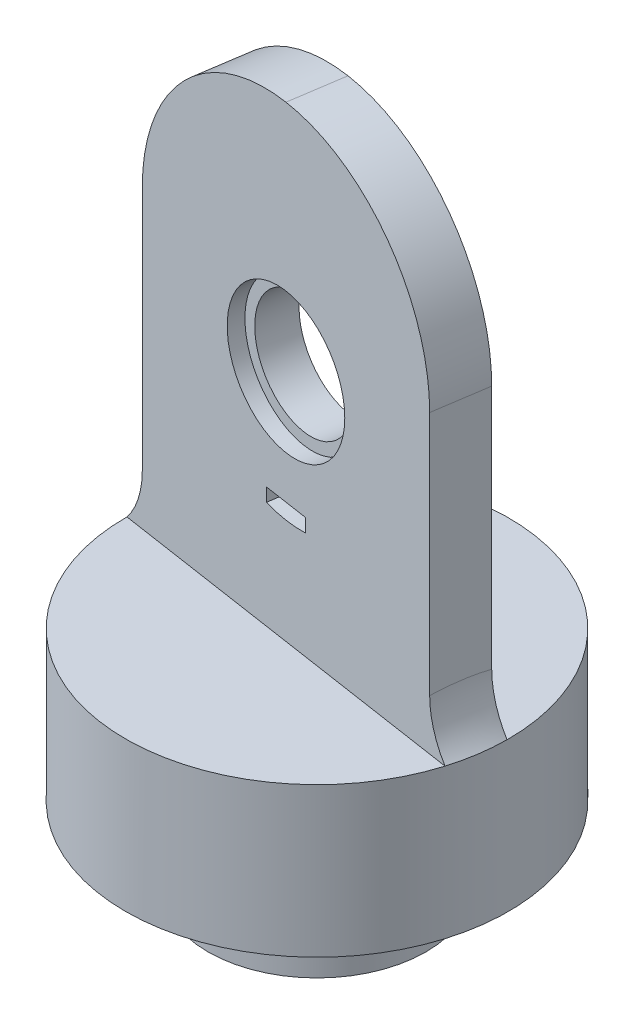
ISO-10303-21;
HEADER;
FILE_DESCRIPTION(('STEP AP214'),'2;1');
FILE_NAME('part.step','',(''),(''),'','','');
FILE_SCHEMA(('AUTOMOTIVE_DESIGN { 1 0 10303 214 1 1 1 1 }'));
ENDSEC;
DATA;
#1=APPLICATION_CONTEXT('core data for automotive mechanical design processes');
#2=APPLICATION_PROTOCOL_DEFINITION('international standard','automotive_design',2000,#1);
#3=PRODUCT_CONTEXT('',#1,'mechanical');
#4=PRODUCT('Part','Part','',(#3));
#5=PRODUCT_RELATED_PRODUCT_CATEGORY('part','',(#4));
#6=PRODUCT_DEFINITION_FORMATION('','',#4);
#7=PRODUCT_DEFINITION_CONTEXT('part definition',#1,'design');
#8=PRODUCT_DEFINITION('design','',#6,#7);
#9=PRODUCT_DEFINITION_SHAPE('','',#8);
#10=(LENGTH_UNIT() NAMED_UNIT(*) SI_UNIT(.MILLI.,.METRE.));
#11=(NAMED_UNIT(*) PLANE_ANGLE_UNIT() SI_UNIT($,.RADIAN.));
#12=(NAMED_UNIT(*) SI_UNIT($,.STERADIAN.) SOLID_ANGLE_UNIT());
#13=UNCERTAINTY_MEASURE_WITH_UNIT(LENGTH_MEASURE(1.E-05),#10,'distance_accuracy_value','');
#14=(GEOMETRIC_REPRESENTATION_CONTEXT(3) GLOBAL_UNCERTAINTY_ASSIGNED_CONTEXT((#13)) GLOBAL_UNIT_ASSIGNED_CONTEXT((#10,
#11,#12)) REPRESENTATION_CONTEXT('',''));
#15=CARTESIAN_POINT('',(0.,0.,0.));
#16=DIRECTION('',(0.,0.,1.));
#17=DIRECTION('',(1.,0.,0.));
#18=AXIS2_PLACEMENT_3D('',#15,#16,#17);
#19=CARTESIAN_POINT('',(0.,2.,0.));
#20=DIRECTION('',(0.,1.,0.));
#21=DIRECTION('',(0.,0.,1.));
#22=AXIS2_PLACEMENT_3D('',#19,#20,#21);
#23=PLANE('',#22);
#24=CARTESIAN_POINT('',(0.,2.,0.));
#25=DIRECTION('',(0.,1.,0.));
#26=DIRECTION('',(0.,0.,1.));
#27=AXIS2_PLACEMENT_3D('',#24,#25,#26);
#28=CIRCLE('',#27,12.3);
#29=CARTESIAN_POINT('',(-12.2996519217612,2.,-0.0925343369505793));
#30=VERTEX_POINT('',#29);
#31=CARTESIAN_POINT('',(11.7756354904741,2.,3.55308440590511));
#32=VERTEX_POINT('',#31);
#33=EDGE_CURVE('E209',#30,#32,#28,.T.);
#34=ORIENTED_EDGE('',*,*,#33,.T.);
#35=DIRECTION('',(0.988728591129862,0.,0.149718980367747));
#36=VECTOR('',#35,1.);
#37=CARTESIAN_POINT('',(-11.138022718072,2.,0.0833662504320445));
#38=LINE('',#37,#36);
#39=EDGE_CURVE('E177',#30,#32,#38,.T.);
#40=ORIENTED_EDGE('',*,*,#39,.F.);
#41=EDGE_LOOP('',(#34,#40));
#42=FACE_BOUND('',#41,.T.);
#43=ADVANCED_FACE('F33',(#42),#23,.T.);
#44=DIRECTION('',(0.988728591129862,0.,0.149718980367747));
#45=VECTOR('',#44,1.);
#46=CARTESIAN_POINT('',(-10.6140062867849,2.,-3.37718381852247));
#47=LINE('',#46,#45);
#48=CARTESIAN_POINT('',(-11.7756354904741,2.,-3.55308440590511));
#49=VERTEX_POINT('',#48);
#50=CARTESIAN_POINT('',(12.2996519217612,2.,0.0925343369505866));
#51=VERTEX_POINT('',#50);
#52=EDGE_CURVE('E179',#49,#51,#47,.T.);
#53=ORIENTED_EDGE('',*,*,#52,.T.);
#54=EDGE_CURVE('E212',#51,#49,#28,.T.);
#55=ORIENTED_EDGE('',*,*,#54,.T.);
#56=EDGE_LOOP('',(#53,#55));
#57=FACE_BOUND('',#56,.T.);
#58=ADVANCED_FACE('F354',(#57),#23,.T.);
#59=CARTESIAN_POINT('',(0.,2.,0.));
#60=DIRECTION('',(0.,-1.,0.));
#61=DIRECTION('',(0.,0.,-1.));
#62=AXIS2_PLACEMENT_3D('',#59,#60,#61);
#63=CYLINDRICAL_SURFACE('',#62,12.3);
#64=EDGE_CURVE('E206',#32,#51,#28,.T.);
#65=ORIENTED_EDGE('',*,*,#64,.F.);
#66=ORIENTED_EDGE('',*,*,#33,.F.);
#67=EDGE_CURVE('E350',#49,#30,#28,.T.);
#68=ORIENTED_EDGE('',*,*,#67,.F.);
#69=ORIENTED_EDGE('',*,*,#54,.F.);
#70=EDGE_LOOP('',(#65,#66,#68,#69));
#71=FACE_BOUND('',#70,.T.);
#72=CARTESIAN_POINT('',(0.,-7.6,0.));
#73=DIRECTION('',(0.,1.,0.));
#74=DIRECTION('',(0.,0.,1.));
#75=AXIS2_PLACEMENT_3D('',#72,#73,#74);
#76=CIRCLE('',#75,12.3);
#77=CARTESIAN_POINT('',(0.,-7.6,12.3));
#78=VERTEX_POINT('',#77);
#79=EDGE_CURVE('E201',#78,#78,#76,.T.);
#80=ORIENTED_EDGE('',*,*,#79,.T.);
#81=EDGE_LOOP('',(#80));
#82=FACE_BOUND('',#81,.T.);
#83=ADVANCED_FACE('F346',(#71,#82),#63,.T.);
#84=CARTESIAN_POINT('',(0.,-7.6,0.));
#85=DIRECTION('',(0.,1.,0.));
#86=DIRECTION('',(0.,0.,1.));
#87=AXIS2_PLACEMENT_3D('',#84,#85,#86);
#88=PLANE('',#87);
#89=CARTESIAN_POINT('',(0.,-7.6,0.));
#90=DIRECTION('',(0.,-1.,0.));
#91=DIRECTION('',(0.,0.,-1.));
#92=AXIS2_PLACEMENT_3D('',#89,#90,#91);
#93=CIRCLE('',#92,7.);
#94=CARTESIAN_POINT('',(0.,-7.6,-7.));
#95=VERTEX_POINT('',#94);
#96=EDGE_CURVE('E202',#95,#95,#93,.T.);
#97=ORIENTED_EDGE('',*,*,#96,.F.);
#98=EDGE_LOOP('',(#97));
#99=FACE_BOUND('',#98,.T.);
#100=ORIENTED_EDGE('',*,*,#79,.F.);
#101=EDGE_LOOP('',(#100));
#102=FACE_BOUND('',#101,.T.);
#103=ADVANCED_FACE('F360',(#99,#102),#88,.F.);
#104=CARTESIAN_POINT('',(0.,-12.5,0.));
#105=DIRECTION('',(0.,1.,0.));
#106=DIRECTION('',(0.,0.,1.));
#107=AXIS2_PLACEMENT_3D('',#104,#105,#106);
#108=CYLINDRICAL_SURFACE('',#107,7.);
#109=CARTESIAN_POINT('',(0.,-12.5,0.));
#110=DIRECTION('',(0.,-1.,0.));
#111=DIRECTION('',(0.,0.,-1.));
#112=AXIS2_PLACEMENT_3D('',#109,#110,#111);
#113=CIRCLE('',#112,7.);
#114=CARTESIAN_POINT('',(0.,-12.5,-7.));
#115=VERTEX_POINT('',#114);
#116=EDGE_CURVE('E196',#115,#115,#113,.T.);
#117=ORIENTED_EDGE('',*,*,#116,.F.);
#118=EDGE_LOOP('',(#117));
#119=FACE_BOUND('',#118,.T.);
#120=ORIENTED_EDGE('',*,*,#96,.T.);
#121=EDGE_LOOP('',(#120));
#122=FACE_BOUND('',#121,.T.);
#123=ADVANCED_FACE('F509',(#119,#122),#108,.T.);
#124=CARTESIAN_POINT('',(0.,-12.5,0.));
#125=DIRECTION('',(0.,-1.,0.));
#126=DIRECTION('',(0.,0.,-1.));
#127=AXIS2_PLACEMENT_3D('',#124,#125,#126);
#128=PLANE('',#127);
#129=CARTESIAN_POINT('',(0.,-12.5,0.));
#130=DIRECTION('',(0.,-1.,0.));
#131=DIRECTION('',(0.,0.,-1.));
#132=AXIS2_PLACEMENT_3D('',#129,#130,#131);
#133=CIRCLE('',#132,3.25);
#134=CARTESIAN_POINT('',(0.,-12.5,-3.25));
#135=VERTEX_POINT('',#134);
#136=EDGE_CURVE('E185',#135,#135,#133,.T.);
#137=ORIENTED_EDGE('',*,*,#136,.F.);
#138=EDGE_LOOP('',(#137));
#139=FACE_BOUND('',#138,.T.);
#140=ORIENTED_EDGE('',*,*,#116,.T.);
#141=EDGE_LOOP('',(#140));
#142=FACE_BOUND('',#141,.T.);
#143=ADVANCED_FACE('F500',(#139,#142),#128,.T.);
#144=CARTESIAN_POINT('',(0.,0.199999999999999,0.));
#145=DIRECTION('',(0.,-1.,0.));
#146=DIRECTION('',(0.,0.,-1.));
#147=AXIS2_PLACEMENT_3D('',#144,#145,#146);
#148=CYLINDRICAL_SURFACE('',#147,3.25);
#149=CARTESIAN_POINT('',(0.,0.199999999999999,0.));
#150=DIRECTION('',(0.,-1.,0.));
#151=DIRECTION('',(0.,0.,-1.));
#152=AXIS2_PLACEMENT_3D('',#149,#150,#151);
#153=CIRCLE('',#152,3.25);
#154=CARTESIAN_POINT('',(0.,0.199999999999999,-3.25));
#155=VERTEX_POINT('',#154);
#156=EDGE_CURVE('E193',#155,#155,#153,.T.);
#157=ORIENTED_EDGE('',*,*,#156,.F.);
#158=EDGE_LOOP('',(#157));
#159=FACE_BOUND('',#158,.T.);
#160=ORIENTED_EDGE('',*,*,#136,.T.);
#161=EDGE_LOOP('',(#160));
#162=FACE_BOUND('',#161,.T.);
#163=ADVANCED_FACE('F490',(#159,#162),#148,.F.);
#164=CARTESIAN_POINT('',(0.,0.199999999999999,0.));
#165=DIRECTION('',(0.,-1.,0.));
#166=DIRECTION('',(0.,0.,-1.));
#167=AXIS2_PLACEMENT_3D('',#164,#165,#166);
#168=PLANE('',#167);
#169=ORIENTED_EDGE('',*,*,#156,.T.);
#170=EDGE_LOOP('',(#169));
#171=FACE_BOUND('',#170,.T.);
#172=ADVANCED_FACE('F252',(#171),#168,.T.);
#173=CARTESIAN_POINT('',(11.138022718072,32.,-0.0833662504320454));
#174=DIRECTION('',(0.988728591129862,0.,0.149718980367746));
#175=DIRECTION('',(0.149718980367746,0.,-0.988728591129862));
#176=AXIS2_PLACEMENT_3D('',#173,#174,#175);
#177=PLANE('',#176);
#178=DIRECTION('',(0.,-1.,0.));
#179=VECTOR('',#178,1.);
#180=CARTESIAN_POINT('',(10.6140062867849,32.,3.37718381852247));
#181=LINE('',#180,#179);
#182=CARTESIAN_POINT('',(10.6140062867849,21.,3.37718381852247));
#183=VERTEX_POINT('',#182);
#184=CARTESIAN_POINT('',(10.6140062867849,5.25496507344838,3.37718381852247));
#185=VERTEX_POINT('',#184);
#186=EDGE_CURVE('E181',#183,#185,#181,.T.);
#187=ORIENTED_EDGE('',*,*,#186,.T.);
#188=CARTESIAN_POINT('',(10.3214639237666,4.82839180538561,5.30910318988391));
#189=CARTESIAN_POINT('',(10.3986652961498,3.26000817502607,4.79927334758672));
#190=CARTESIAN_POINT('',(11.4327059966444,2.,4.53687487090954));
#191=CARTESIAN_POINT('',(10.342585978601,4.87474183830589,5.16961533425665));
#192=CARTESIAN_POINT('',(10.4166230443052,3.27663489239898,4.68068224450884));
#193=CARTESIAN_POINT('',(11.4706790496654,2.,4.44120582104052));
#194=CARTESIAN_POINT('',(10.3638853220652,4.91735506347584,5.0289566829377));
#195=CARTESIAN_POINT('',(10.4347443174218,3.29151083388634,4.56101123957622));
#196=CARTESIAN_POINT('',(11.5079818106291,2.,4.34368149071787));
#197=CARTESIAN_POINT('',(10.4067548872042,4.99573483675469,4.74585052874036));
#198=CARTESIAN_POINT('',(10.4712952127414,3.3182835360083,4.31963292438134));
#199=CARTESIAN_POINT('',(11.5808797029572,2.,4.14539820359588));
#200=CARTESIAN_POINT('',(10.4283249791628,5.03150453950229,4.60340388249463));
#201=CARTESIAN_POINT('',(10.489721191021,3.33017150777237,4.19794967821051));
#202=CARTESIAN_POINT('',(11.6164756154242,2.,4.04464076228806));
#203=CARTESIAN_POINT('',(10.4716265754946,5.09679735594471,4.31744463918663));
#204=CARTESIAN_POINT('',(10.5267838928038,3.35142579754127,3.95319144630688));
#205=CARTESIAN_POINT('',(11.6855560399188,2.,3.84049213034124));
#206=CARTESIAN_POINT('',(10.4933576468343,5.12633340416124,4.17393490183294));
#207=CARTESIAN_POINT('',(10.5454157501711,3.36078926044809,3.83014859603067));
#208=CARTESIAN_POINT('',(11.7190448206797,2.,3.73710690209606));
#209=CARTESIAN_POINT('',(10.5369767109361,5.17974148796943,3.8858791343551));
#210=CARTESIAN_POINT('',(10.5828806339486,3.37739394932021,3.58273439601947));
#211=CARTESIAN_POINT('',(11.7837210611285,2.,3.52787733102598));
#212=CARTESIAN_POINT('',(10.5588647243665,5.20361276289023,3.74133296774002));
#213=CARTESIAN_POINT('',(10.6017085260136,3.38462851301482,3.45839695296721));
#214=CARTESIAN_POINT('',(11.8149082113644,2.,3.42203266003764));
#215=CARTESIAN_POINT('',(10.623878009283,5.26655215262242,3.31199198877905));
#216=CARTESIAN_POINT('',(10.6577603759894,3.40340551682259,3.08823635929532));
#217=CARTESIAN_POINT('',(11.9035299310385,2.,3.10537281065239));
#218=CARTESIAN_POINT('',(10.6671688992274,5.29813559755995,3.02610344934059));
#219=CARTESIAN_POINT('',(10.6951351202005,3.41233901238911,2.84141743161585));
#220=CARTESIAN_POINT('',(11.9573388235148,2.,2.89156946591438));
#221=CARTESIAN_POINT('',(10.7539918544662,5.3431111993212,2.45273367351071));
#222=CARTESIAN_POINT('',(10.7702635292307,3.42488954199525,2.34527722392919));
#223=CARTESIAN_POINT('',(12.0538391584883,2.,2.45850829389656));
#224=CARTESIAN_POINT('',(10.7975241039297,5.35648671418348,2.16525122088483));
#225=CARTESIAN_POINT('',(10.8079671635041,3.42848385167703,2.09628634044853));
#226=CARTESIAN_POINT('',(12.0965204016051,2.,2.23924566295477));
#227=CARTESIAN_POINT('',(10.8894469604464,5.36635290590999,1.55820222687525));
#228=CARTESIAN_POINT('',(10.8876675434005,3.43115626414959,1.56995331217154));
#229=CARTESIAN_POINT('',(12.1739641077632,2.,1.77375627106607));
#230=CARTESIAN_POINT('',(10.9378426242937,5.36081344007558,1.23860229094816));
#231=CARTESIAN_POINT('',(10.9296072216232,3.42968674554214,1.29298803455823));
#232=CARTESIAN_POINT('',(12.2073294788628,2.,1.52722836299262));
#233=CARTESIAN_POINT('',(11.0344366676583,5.32788386130741,0.600705264313045));
#234=CARTESIAN_POINT('',(11.0132868006651,3.42066275610049,0.740376788547306));
#235=CARTESIAN_POINT('',(12.2588716274398,2.,1.03499791901754));
#236=CARTESIAN_POINT('',(11.0826351763133,5.30051165217863,0.282407320792765));
#237=CARTESIAN_POINT('',(11.0549557441636,3.41312887559618,0.465199414924089));
#238=CARTESIAN_POINT('',(12.277060825048,2.,0.789294872412392));
#239=CARTESIAN_POINT('',(11.1551057758791,5.2410431253027,-0.196180989326531));
#240=CARTESIAN_POINT('',(11.1175362689066,3.39579652252535,0.0519241313940927));
#241=CARTESIAN_POINT('',(12.2934006217747,2.,0.42170235925767));
#242=CARTESIAN_POINT('',(11.1795448645373,5.21781267095227,-0.3575741916993));
#243=CARTESIAN_POINT('',(11.1385921749009,3.38892429400321,-0.0871268841651647));
#244=CARTESIAN_POINT('',(12.2970014244925,2.,0.29805967733537));
#245=CARTESIAN_POINT('',(11.2282555452492,5.1645959891964,-0.679254466270841));
#246=CARTESIAN_POINT('',(11.1804967727632,3.37273731431042,-0.363860494723964));
#247=CARTESIAN_POINT('',(12.3004995922828,2.,0.05257365543771));
#248=CARTESIAN_POINT('',(11.2525271634631,5.13461084273096,-0.839541711228594));
#249=CARTESIAN_POINT('',(11.2013379347778,3.36343062891468,-0.501493363352807));
#250=CARTESIAN_POINT('',(12.3003975494966,2.,-0.069269969116612));
#251=CARTESIAN_POINT('',(11.3008920235469,5.06721120553812,-1.1589382223019));
#252=CARTESIAN_POINT('',(11.2427927921006,3.34188750300052,-0.775256934114432));
#253=CARTESIAN_POINT('',(12.2966659835431,2.,-0.310816255603539));
#254=CARTESIAN_POINT('',(11.3249848053702,5.02978181168544,-1.31804445031652));
#255=CARTESIAN_POINT('',(11.2633994788085,3.32965539469422,-0.911341352178931));
#256=CARTESIAN_POINT('',(12.2930293264975,2.,-0.430514089062021));
#257=CARTESIAN_POINT('',(11.3728621781473,4.94667330965841,-1.63422164586434));
#258=CARTESIAN_POINT('',(11.3042649823875,3.30164135021393,-1.18121289204773));
#259=CARTESIAN_POINT('',(12.2824806776444,2.,-0.666895645381488));
#260=CARTESIAN_POINT('',(11.3966465917794,4.9009896624974,-1.79129144238287));
#261=CARTESIAN_POINT('',(11.3245184137625,3.28587071697418,-1.31496444859588));
#262=CARTESIAN_POINT('',(12.2755668803354,2.,-0.783577669303654));
#263=CARTESIAN_POINT('',(11.4202234374693,4.85076951524133,-1.94699048177643));
#264=CARTESIAN_POINT('',(11.344579861763,3.26799770168961,-1.44744816688476));
#265=CARTESIAN_POINT('',(12.2671480602123,2.,-0.898375460946205));
#266=(BOUNDED_SURFACE() B_SPLINE_SURFACE(3,2,((#188,#189,#190),(#191,#192,#193),(#194,#195,
#196),(#197,#198,#199),(#200,#201,#202),(#203,#204,#205),(#206,#207,#208),(#209,#210,#211),
(#212,#213,#214),(#215,#216,#217),(#218,#219,#220),(#221,#222,#223),(#224,#225,#226),(#227,#228,
#229),(#230,#231,#232),(#233,#234,#235),(#236,#237,#238),(#239,#240,#241),(#242,#243,#244),
(#245,#246,#247),(#248,#249,#250),(#251,#252,#253),(#254,#255,#256),(#257,#258,#259),(#260,#261,
#262),(#263,#264,#265)),.UNSPECIFIED.,.F.,.F.,.F.) B_SPLINE_SURFACE_WITH_KNOTS((4,2,2,2,2,2,2,2,
2,2,2,2,4),(3,3),(0.,0.445378405467933,0.890551008856788,1.33479061699057,1.77908984430686,
2.65098561402121,3.52367775846463,4.4928485547848,5.46122540473011,5.9557430850826,
6.45018168489714,6.94562028210751,7.44133215314482),(0.,1.),
.UNSPECIFIED.) GEOMETRIC_REPRESENTATION_ITEM() RATIONAL_B_SPLINE_SURFACE(((1.,0.949573611017432,
1.),(1.,0.948350895766873,1.),(1.,0.94717529807741,1.),(1.,0.944934959078809,1.),(1.,
0.943870166795765,1.),(1.,0.94186899937263,1.),(1.,0.94093235977216,1.),(1.,0.939197283093598,
1.),(1.,0.938398864579846,1.),(1.,0.936254605183784,1.),(1.,0.935121437832492,1.),(1.,
0.933485189333774,1.),(1.,0.932982684641708,1.),(1.,0.932614030476096,1.),(1.,0.932824373505298,
1.),(1.,0.934042174675482,1.),(1.,0.935048979677241,1.),(1.,0.937124918378328,1.),(1.,
0.937922475913505,1.),(1.,0.939695749850841,1.),(1.,0.940671437742422,1.),(1.,0.942787409640719,
1.),(1.,0.943928022550502,1.),(1.,0.946352045505888,1.),(1.,0.94763553396846,1.),(1.,
0.948979654115154,1.))) REPRESENTATION_ITEM('') SURFACE());
#267=CARTESIAN_POINT('',(10.3214639237666,4.82839180538561,5.30910318988391));
#268=CARTESIAN_POINT('',(10.342585978601,4.87474183830589,5.16961533425665));
#269=CARTESIAN_POINT('',(10.3638853220652,4.91735506347584,5.0289566829377));
#270=CARTESIAN_POINT('',(10.4067548872043,4.99573483675469,4.74585052874036));
#271=CARTESIAN_POINT('',(10.4283249791628,5.03150453950229,4.60340388249463));
#272=CARTESIAN_POINT('',(10.4716265754946,5.09679735594471,4.31744463918663));
#273=CARTESIAN_POINT('',(10.4933576468343,5.12633340416124,4.17393490183294));
#274=CARTESIAN_POINT('',(10.5369767109361,5.17974148796943,3.8858791343551));
#275=CARTESIAN_POINT('',(10.5588647243665,5.20361276289023,3.74133296774002));
#276=CARTESIAN_POINT('',(10.623878009283,5.26655215262242,3.31199198877905));
#277=CARTESIAN_POINT('',(10.6671688992274,5.29813559755995,3.02610344934059));
#278=CARTESIAN_POINT('',(10.7539918544662,5.3431111993212,2.45273367351071));
#279=CARTESIAN_POINT('',(10.7975241039297,5.35648671418348,2.16525122088483));
#280=CARTESIAN_POINT('',(10.8894469604464,5.36635290590999,1.55820222687525));
#281=CARTESIAN_POINT('',(10.9378426242937,5.36081344007558,1.23860229094816));
#282=CARTESIAN_POINT('',(11.0344366676583,5.32788386130741,0.600705264313045));
#283=CARTESIAN_POINT('',(11.0826351763133,5.30051165217863,0.282407320792765));
#284=CARTESIAN_POINT('',(11.1551057758791,5.2410431253027,-0.196180989326531));
#285=CARTESIAN_POINT('',(11.1795448645373,5.21781267095227,-0.3575741916993));
#286=CARTESIAN_POINT('',(11.2282555452492,5.1645959891964,-0.679254466270841));
#287=CARTESIAN_POINT('',(11.2525271634631,5.13461084273096,-0.839541711228594));
#288=CARTESIAN_POINT('',(11.3008920235469,5.06721120553812,-1.1589382223019));
#289=CARTESIAN_POINT('',(11.3249848053702,5.02978181168544,-1.31804445031652));
#290=CARTESIAN_POINT('',(11.3728621781473,4.94667330965841,-1.63422164586434));
#291=CARTESIAN_POINT('',(11.3966465917794,4.9009896624974,-1.79129144238287));
#292=CARTESIAN_POINT('',(11.4202234374693,4.85076951524133,-1.94699048177643));
#293=B_SPLINE_CURVE_WITH_KNOTS('',3,(#267,#268,#269,#270,#271,#272,#273,#274,#275,#276,#277,
#278,#279,#280,#281,#282,#283,#284,#285,#286,#287,#288,#289,#290,#291,#292),.UNSPECIFIED.,.F.,
.F.,(4,2,2,2,2,2,2,2,2,2,2,2,4),(0.,0.445378405467933,0.890551008856788,1.33479061699057,
1.77908984430686,2.65098561402121,3.52367775846463,4.4928485547848,5.46122540473011,
5.9557430850826,6.45018168489714,6.94562028210751,7.44133215314482),.UNSPECIFIED.);
#294=CARTESIAN_POINT('',(11.138022718072,5.25496507344838,-0.0833662504320454));
#295=VERTEX_POINT('',#294);
#296=EDGE_CURVE('E225',#185,#295,#293,.T.);
#297=ORIENTED_EDGE('',*,*,#296,.T.);
#298=DIRECTION('',(0.,-1.,0.));
#299=VECTOR('',#298,1.);
#300=CARTESIAN_POINT('',(11.138022718072,32.,-0.0833662504320454));
#301=LINE('',#300,#299);
#302=CARTESIAN_POINT('',(11.138022718072,21.,-0.0833662504320454));
#303=VERTEX_POINT('',#302);
#304=EDGE_CURVE('E182',#303,#295,#301,.T.);
#305=ORIENTED_EDGE('',*,*,#304,.F.);
#306=DIRECTION('',(-0.149718980367746,0.,0.988728591129862));
#307=VECTOR('',#306,1.);
#308=CARTESIAN_POINT('',(11.138022718072,21.,-0.0833662504320454));
#309=LINE('',#308,#307);
#310=EDGE_CURVE('E223',#303,#183,#309,.T.);
#311=ORIENTED_EDGE('',*,*,#310,.T.);
#312=EDGE_LOOP('',(#187,#297,#305,#311));
#313=FACE_BOUND('',#312,.T.);
#314=ADVANCED_FACE('F246',(#313),#177,.T.);
#315=CARTESIAN_POINT('',(-10.6140062867849,32.,-3.37718381852247));
#316=DIRECTION('',(0.149718980367747,0.,-0.988728591129862));
#317=DIRECTION('',(-0.988728591129862,0.,-0.149718980367747));
#318=AXIS2_PLACEMENT_3D('',#315,#316,#317);
#319=PLANE('',#318);
#320=CARTESIAN_POINT('',(0.262008215643557,17.,-1.73027503447726));
#321=DIRECTION('',(0.149718980367747,0.,-0.988728591129862));
#322=DIRECTION('',(-0.988728591129862,0.,-0.149718980367747));
#323=AXIS2_PLACEMENT_3D('',#320,#321,#322);
#324=CIRCLE('',#323,3.75);
#325=CARTESIAN_POINT('',(-3.44572400109343,17.,-2.29172121085631));
#326=VERTEX_POINT('',#325);
#327=EDGE_CURVE('E161',#326,#326,#324,.F.);
#328=ORIENTED_EDGE('',*,*,#327,.T.);
#329=EDGE_LOOP('',(#328));
#330=FACE_BOUND('',#329,.T.);
#331=DIRECTION('',(0.,-1.,0.));
#332=VECTOR('',#331,1.);
#333=CARTESIAN_POINT('',(-10.6140062867849,32.,-3.37718381852247));
#334=LINE('',#333,#332);
#335=CARTESIAN_POINT('',(-10.6140062867849,21.,-3.37718381852247));
#336=VERTEX_POINT('',#335);
#337=CARTESIAN_POINT('',(-10.6140062867849,5.25496507344838,-3.37718381852247));
#338=VERTEX_POINT('',#337);
#339=EDGE_CURVE('E186',#336,#338,#334,.T.);
#340=ORIENTED_EDGE('',*,*,#339,.F.);
#341=CARTESIAN_POINT('',(0.262008215643555,21.,-1.73027503447726));
#342=DIRECTION('',(0.149718980367747,0.,-0.988728591129862));
#343=DIRECTION('',(-0.988728591129862,0.,-0.149718980367747));
#344=AXIS2_PLACEMENT_3D('',#341,#342,#343);
#345=CIRCLE('',#344,11.);
#346=CARTESIAN_POINT('',(0.26200821564356,32.,-1.73027503447726));
#347=VERTEX_POINT('',#346);
#348=EDGE_CURVE('E221',#336,#347,#345,.T.);
#349=ORIENTED_EDGE('',*,*,#348,.T.);
#350=CARTESIAN_POINT('',(0.262008215643558,21.,-1.73027503447726));
#351=DIRECTION('',(0.149718980367747,0.,-0.988728591129862));
#352=DIRECTION('',(-0.988728591129862,0.,-0.149718980367747));
#353=AXIS2_PLACEMENT_3D('',#350,#351,#352);
#354=CIRCLE('',#353,11.);
#355=EDGE_CURVE('E219',#347,#303,#354,.T.);
#356=ORIENTED_EDGE('',*,*,#355,.T.);
#357=ORIENTED_EDGE('',*,*,#304,.T.);
#358=CARTESIAN_POINT('',(11.138022718072,5.25496507344838,-0.0833662504320451));
#359=CARTESIAN_POINT('',(11.1380066805487,5.1095567470639,-0.0833686789262437));
#360=CARTESIAN_POINT('',(11.1441942813575,4.96415087450629,-0.0824317167585356));
#361=CARTESIAN_POINT('',(11.1688403134422,4.67442715262069,-0.0786996725687161));
#362=CARTESIAN_POINT('',(11.1872969899803,4.53010915068879,-0.075904856259113));
#363=CARTESIAN_POINT('',(11.2356515476384,4.24765164690677,-0.0685827305173828));
#364=CARTESIAN_POINT('',(11.2652112550172,4.10945281367856,-0.0641066293017031));
#365=CARTESIAN_POINT('',(11.3355670783171,3.83601251185544,-0.0534529451442));
#366=CARTESIAN_POINT('',(11.3763633065394,3.70077107283224,-0.0472753451970627));
#367=CARTESIAN_POINT('',(11.4713013812735,3.42727240615612,-0.0328992748833551));
#368=CARTESIAN_POINT('',(11.5260245159435,3.28922118485578,-0.0246127825144458));
#369=CARTESIAN_POINT('',(11.6471644471581,3.01846023255317,-0.00626907611616808));
#370=CARTESIAN_POINT('',(11.7135822326978,2.88575095447635,0.00378828767254911));
#371=CARTESIAN_POINT('',(11.859817645697,2.62272937005919,0.0259320965239405));
#372=CARTESIAN_POINT('',(11.9399831708467,2.49261473498774,0.0380712222594894));
#373=CARTESIAN_POINT('',(12.1115531735707,2.24018858254681,0.0640513406660813));
#374=CARTESIAN_POINT('',(12.2029583680589,2.11787756368163,0.0778924418963463));
#375=CARTESIAN_POINT('',(12.2996519217613,2.00000000000002,0.0925343369505956));
#376=B_SPLINE_CURVE_WITH_KNOTS('',3,(#358,#359,#360,#361,#362,#363,#364,#365,#366,#367,#368,
#369,#370,#371,#372,#373,#374,#375),.UNSPECIFIED.,.F.,.F.,(4,2,2,2,2,2,2,2,4),(0.,
0.436087812668885,0.872113268955345,1.29581296862591,1.71951690303828,2.16514320921757,
2.61080721931242,3.07011110165096,3.5294442955522),.UNSPECIFIED.);
#377=EDGE_CURVE('E304',#295,#51,#376,.T.);
#378=ORIENTED_EDGE('',*,*,#377,.T.);
#379=ORIENTED_EDGE('',*,*,#52,.F.);
#380=CARTESIAN_POINT('',(-10.3214639237666,4.8283918053856,-5.30910318988389));
#381=CARTESIAN_POINT('',(-10.3986652899304,3.26000817797223,-4.79927338865941));
#382=CARTESIAN_POINT('',(-11.4327059689429,2.,-4.53687494071618));
#383=CARTESIAN_POINT('',(-10.342585978601,4.87474183830588,-5.16961533425663));
#384=CARTESIAN_POINT('',(-10.4166230420621,3.27663489345301,-4.68068225932195));
#385=CARTESIAN_POINT('',(-11.4706790397148,2.,-4.44120584611646));
#386=CARTESIAN_POINT('',(-10.3638853220652,4.91735506347584,-5.02895668293769));
#387=CARTESIAN_POINT('',(-10.4347443168178,3.29151083416803,-4.56101124356519));
#388=CARTESIAN_POINT('',(-11.5079818079604,2.,-4.34368149744388));
#389=CARTESIAN_POINT('',(-10.4067548872043,4.99573483675469,-4.74585052874034));
#390=CARTESIAN_POINT('',(-10.4712952133485,3.31828353572911,-4.31963292037203));
#391=CARTESIAN_POINT('',(-11.5808797056189,2.,-4.14539819688862));
#392=CARTESIAN_POINT('',(-10.4283249791628,5.03150453950228,-4.60340388249462));
#393=CARTESIAN_POINT('',(-10.4897211911846,3.33017150769762,-4.19794967712961));
#394=CARTESIAN_POINT('',(-11.6164756161389,2.,-4.04464076048672));
#395=CARTESIAN_POINT('',(-10.4716265754946,5.0967973559447,-4.31744463918662));
#396=CARTESIAN_POINT('',(-10.5267838926398,3.3514257976153,-3.95319144739022));
#397=CARTESIAN_POINT('',(-11.6855560392077,2.,-3.84049213213278));
#398=CARTESIAN_POINT('',(-10.4933576468343,5.12633340416123,-4.17393490183293));
#399=CARTESIAN_POINT('',(-10.5454157501259,3.36078926046835,-3.83014859632898));
#400=CARTESIAN_POINT('',(-11.7190448204847,2.,-3.73710690258758));
#401=CARTESIAN_POINT('',(-10.5369767109361,5.17974148796943,-3.88587913435509));
#402=CARTESIAN_POINT('',(-10.582880633994,3.37739394930008,-3.58273439572007));
#403=CARTESIAN_POINT('',(-11.7837210613229,2.,-3.52787733053637));
#404=CARTESIAN_POINT('',(-10.5588647243665,5.20361276289022,-3.74133296774001));
#405=CARTESIAN_POINT('',(-10.6017085260294,3.38462851300784,-3.45839695286259));
#406=CARTESIAN_POINT('',(-11.814908211432,2.,-3.42203265986713));
#407=CARTESIAN_POINT('',(-10.623878009283,5.26655215262241,-3.31199198877905));
#408=CARTESIAN_POINT('',(-10.6577603759581,3.4034055168362,-3.08823635950196));
#409=CARTESIAN_POINT('',(-11.9035299309063,2.,-3.10537281098558));
#410=CARTESIAN_POINT('',(-10.6671688992274,5.29813559755994,-3.02610344934059));
#411=CARTESIAN_POINT('',(-10.6951351201917,3.4123390123928,-2.84141743167362));
#412=CARTESIAN_POINT('',(-11.9573388234786,2.,-2.89156946600715));
#413=CARTESIAN_POINT('',(-10.7539918544662,5.3431111993212,-2.45273367351071));
#414=CARTESIAN_POINT('',(-10.7702635292392,3.42488954199163,-2.34527722387291));
#415=CARTESIAN_POINT('',(-12.0538391585236,2.,-2.45850829380759));
#416=CARTESIAN_POINT('',(-10.7975241039297,5.35648671418347,-2.16525122088482));
#417=CARTESIAN_POINT('',(-10.8079671635069,3.42848385167601,-2.09628634042973));
#418=CARTESIAN_POINT('',(-12.0965204016159,2.,-2.23924566292475));
#419=CARTESIAN_POINT('',(-10.8894469604464,5.36635290590998,-1.55820222687524));
#420=CARTESIAN_POINT('',(-10.8876675433983,3.43115626415069,-1.56995331218611));
#421=CARTESIAN_POINT('',(-12.1739641077532,2.,-1.7737562710881));
#422=CARTESIAN_POINT('',(-10.9378426242937,5.36081344007557,-1.23860229094815));
#423=CARTESIAN_POINT('',(-10.9296072216225,3.42968674554242,-1.29298803456286));
#424=CARTESIAN_POINT('',(-12.20732947886,2.,-1.52722836299977));
#425=CARTESIAN_POINT('',(-11.0344366676583,5.3278838613074,-0.60070526431304));
#426=CARTESIAN_POINT('',(-11.0132868006656,3.42066275610018,-0.740376788544245));
#427=CARTESIAN_POINT('',(-12.2588716274423,2.,-1.03499791901323));
#428=CARTESIAN_POINT('',(-11.0826351763133,5.30051165217863,-0.282407320792762));
#429=CARTESIAN_POINT('',(-11.0549557441637,3.41312887559612,-0.465199414923458));
#430=CARTESIAN_POINT('',(-12.2770608250484,2.,-0.789294872411486));
#431=CARTESIAN_POINT('',(-11.1551057758791,5.2410431253027,0.196180989326533));
#432=CARTESIAN_POINT('',(-11.1175362689065,3.39579652252537,-0.0519241313946269));
#433=CARTESIAN_POINT('',(-12.2934006217744,2.,-0.421702359258504));
#434=CARTESIAN_POINT('',(-11.1795448645373,5.21781267095227,0.357574191699303));
#435=CARTESIAN_POINT('',(-11.1385921749008,3.3889242940032,0.0871268841646815));
#436=CARTESIAN_POINT('',(-12.2970014244924,2.,-0.298059677336203));
#437=CARTESIAN_POINT('',(-11.2282555452492,5.1645959891964,0.679254466270845));
#438=CARTESIAN_POINT('',(-11.1804967727631,3.37273731431035,0.363860494722861));
#439=CARTESIAN_POINT('',(-12.3004995922829,2.,-0.0525736554397203));
#440=CARTESIAN_POINT('',(-11.2525271634631,5.13461084273095,0.839541711228599));
#441=CARTESIAN_POINT('',(-11.2013379347776,3.36343062891458,0.501493363351033));
#442=CARTESIAN_POINT('',(-12.3003975494966,2.,0.0692699691134245));
#443=CARTESIAN_POINT('',(-11.3008920235469,5.06721120553811,1.1589382223019));
#444=CARTESIAN_POINT('',(-11.2427927921005,3.34188750300046,0.775256934113321));
#445=CARTESIAN_POINT('',(-12.2966659835431,2.,0.310816255601541));
#446=CARTESIAN_POINT('',(-11.3249848053702,5.02978181168543,1.31804445031652));
#447=CARTESIAN_POINT('',(-11.2633994788086,3.32965539469423,0.91134135217914));
#448=CARTESIAN_POINT('',(-12.2930293264975,2.,0.430514089062398));
#449=CARTESIAN_POINT('',(-11.3728621781473,4.9466733096584,1.63422164586434));
#450=CARTESIAN_POINT('',(-11.3042649823877,3.30164135021401,1.18121289204918));
#451=CARTESIAN_POINT('',(-12.2824806776443,2.,0.666895645384121));
#452=CARTESIAN_POINT('',(-11.3966465917794,4.90098966249739,1.79129144238287));
#453=CARTESIAN_POINT('',(-11.3245184137628,3.28587071697426,1.31496444859726));
#454=CARTESIAN_POINT('',(-12.2755668803354,2.,0.783577669306169));
#455=CARTESIAN_POINT('',(-11.4202234374693,4.85076951524132,1.94699048177643));
#456=CARTESIAN_POINT('',(-11.3445798617629,3.26799770168954,1.44744816688373));
#457=CARTESIAN_POINT('',(-12.2671480602124,2.,0.898375460944324));
#458=(BOUNDED_SURFACE() B_SPLINE_SURFACE(3,2,((#380,#381,#382),(#383,#384,#385),(#386,#387,
#388),(#389,#390,#391),(#392,#393,#394),(#395,#396,#397),(#398,#399,#400),(#401,#402,#403),
(#404,#405,#406),(#407,#408,#409),(#410,#411,#412),(#413,#414,#415),(#416,#417,#418),(#419,#420,
#421),(#422,#423,#424),(#425,#426,#427),(#428,#429,#430),(#431,#432,#433),(#434,#435,#436),
(#437,#438,#439),(#440,#441,#442),(#443,#444,#445),(#446,#447,#448),(#449,#450,#451),(#452,#453,
#454),(#455,#456,#457)),.UNSPECIFIED.,.F.,.F.,.F.) B_SPLINE_SURFACE_WITH_KNOTS((4,2,2,2,2,2,2,2,
2,2,2,2,4),(3,3),(0.,0.445378405467931,0.890551008856784,1.33479061699056,1.77908984430685,
2.6509856140212,3.52367775846463,4.49284855478479,5.46122540473009,5.95574308508258,
6.45018168489713,6.94562028210749,7.44133215314481),(0.,1.),
.UNSPECIFIED.) GEOMETRIC_REPRESENTATION_ITEM() RATIONAL_B_SPLINE_SURFACE(((1.,0.949573611909305,
1.),(1.,0.948350896087231,1.),(1.,0.947175298163325,1.),(1.,0.944934958993111,1.),(1.,
0.94387016677276,1.),(1.,0.941868999395529,1.),(1.,0.940932359778438,1.),(1.,0.939197283087337,
1.),(1.,0.938398864577671,1.),(1.,0.936254605188044,1.),(1.,0.935121437833646,1.),(1.,
0.933485189332635,1.),(1.,0.932982684641386,1.),(1.,0.932614030476446,1.),(1.,0.932824373505386,
1.),(1.,0.934042174675387,1.),(1.,0.935048979677224,1.),(1.,0.937124918378335,1.),(1.,
0.937922475913503,1.),(1.,0.939695749850822,1.),(1.,0.940671437742394,1.),(1.,0.942787409640703,
1.),(1.,0.943928022550508,1.),(1.,0.946352045505914,1.),(1.,0.947635533968483,1.),(1.,
0.948979654115132,1.))) REPRESENTATION_ITEM('') SURFACE());
#459=CARTESIAN_POINT('',(-11.7756354904741,2.,-3.5530844059051));
#460=CARTESIAN_POINT('',(-11.6837985253012,2.11196071479185,-3.53917792346987));
#461=CARTESIAN_POINT('',(-11.596729844522,2.22791867024052,-3.52599348213261));
#462=CARTESIAN_POINT('',(-11.4327077448404,2.46691408290915,-3.50115631069606));
#463=CARTESIAN_POINT('',(-11.3557530443491,2.58995064032084,-3.48950338653121));
#464=CARTESIAN_POINT('',(-11.2145396635675,2.83864964674459,-3.46812004273537));
#465=CARTESIAN_POINT('',(-11.1499834558565,2.96413940254664,-3.45834456978799));
#466=CARTESIAN_POINT('',(-11.0313821088672,3.22010086556461,-3.44038527044053));
#467=CARTESIAN_POINT('',(-10.9773370395384,3.35057260592778,-3.43220145463263));
#468=CARTESIAN_POINT('',(-10.8776629758996,3.62234263872695,-3.41710823358998));
#469=CARTESIAN_POINT('',(-10.8326012737418,3.76385416963682,-3.41028473100168));
#470=CARTESIAN_POINT('',(-10.754850394008,4.05032170243658,-3.3985112447883));
#471=CARTESIAN_POINT('',(-10.7221622033156,4.19527797809213,-3.39356141060284));
#472=CARTESIAN_POINT('',(-10.6686245748575,4.49199941088139,-3.38545443441547));
#473=CARTESIAN_POINT('',(-10.648167808263,4.64383721869057,-3.38235675294491));
#474=CARTESIAN_POINT('',(-10.620848326886,4.94877075498443,-3.37821987965872));
#475=CARTESIAN_POINT('',(-10.6139867521427,5.10186658788129,-3.37718086047439));
#476=CARTESIAN_POINT('',(-10.6140062867849,5.25496507344838,-3.37718381852247));
#477=B_SPLINE_CURVE_WITH_KNOTS('',3,(#459,#460,#461,#462,#463,#464,#465,#466,#467,#468,#469,
#470,#471,#472,#473,#474,#475,#476),.UNSPECIFIED.,.F.,.F.,(4,2,2,2,2,2,2,2,4),(0.,
0.43628511868438,0.872514900271897,1.29640658016227,1.72030108087438,2.16573809853478,
2.61121063577755,3.07030811150052,3.52944408369396),.UNSPECIFIED.);
#478=EDGE_CURVE('E11',#49,#338,#477,.T.);
#479=ORIENTED_EDGE('',*,*,#478,.T.);
#480=EDGE_LOOP('',(#340,#349,#356,#357,#378,#379,#479));
#481=FACE_BOUND('',#480,.T.);
#482=ADVANCED_FACE('F251',(#330,#481),#319,.T.);
#483=CARTESIAN_POINT('',(-10.6140062867849,32.,-3.37718381852247));
#484=DIRECTION('',(0.988728591129862,0.,0.149718980367746));
#485=DIRECTION('',(0.149718980367746,0.,-0.988728591129863));
#486=AXIS2_PLACEMENT_3D('',#483,#484,#485);
#487=PLANE('',#486);
#488=ORIENTED_EDGE('',*,*,#339,.T.);
#489=CARTESIAN_POINT('',(-10.3214639237666,4.8283918053856,-5.30910318988389));
#490=CARTESIAN_POINT('',(-10.342585978601,4.87474183830588,-5.16961533425663));
#491=CARTESIAN_POINT('',(-10.3638853220652,4.91735506347584,-5.02895668293769));
#492=CARTESIAN_POINT('',(-10.4067548872043,4.99573483675469,-4.74585052874034));
#493=CARTESIAN_POINT('',(-10.4283249791628,5.03150453950228,-4.60340388249462));
#494=CARTESIAN_POINT('',(-10.4716265754946,5.0967973559447,-4.31744463918662));
#495=CARTESIAN_POINT('',(-10.4933576468343,5.12633340416123,-4.17393490183293));
#496=CARTESIAN_POINT('',(-10.5369767109361,5.17974148796943,-3.88587913435509));
#497=CARTESIAN_POINT('',(-10.5588647243665,5.20361276289022,-3.74133296774001));
#498=CARTESIAN_POINT('',(-10.623878009283,5.26655215262241,-3.31199198877905));
#499=CARTESIAN_POINT('',(-10.6671688992274,5.29813559755994,-3.02610344934059));
#500=CARTESIAN_POINT('',(-10.7539918544662,5.3431111993212,-2.45273367351071));
#501=CARTESIAN_POINT('',(-10.7975241039297,5.35648671418347,-2.16525122088482));
#502=CARTESIAN_POINT('',(-10.8894469604464,5.36635290590998,-1.55820222687524));
#503=CARTESIAN_POINT('',(-10.9378426242937,5.36081344007557,-1.23860229094815));
#504=CARTESIAN_POINT('',(-11.0344366676583,5.3278838613074,-0.60070526431304));
#505=CARTESIAN_POINT('',(-11.0826351763133,5.30051165217863,-0.282407320792761));
#506=CARTESIAN_POINT('',(-11.1551057758791,5.2410431253027,0.196180989326533));
#507=CARTESIAN_POINT('',(-11.1795448645373,5.21781267095227,0.357574191699303));
#508=CARTESIAN_POINT('',(-11.2282555452492,5.1645959891964,0.679254466270845));
#509=CARTESIAN_POINT('',(-11.2525271634631,5.13461084273095,0.839541711228599));
#510=CARTESIAN_POINT('',(-11.3008920235469,5.06721120553811,1.1589382223019));
#511=CARTESIAN_POINT('',(-11.3249848053702,5.02978181168543,1.31804445031652));
#512=CARTESIAN_POINT('',(-11.3728621781473,4.9466733096584,1.63422164586434));
#513=CARTESIAN_POINT('',(-11.3966465917794,4.90098966249739,1.79129144238287));
#514=CARTESIAN_POINT('',(-11.4202234374693,4.85076951524132,1.94699048177643));
#515=B_SPLINE_CURVE_WITH_KNOTS('',3,(#489,#490,#491,#492,#493,#494,#495,#496,#497,#498,#499,
#500,#501,#502,#503,#504,#505,#506,#507,#508,#509,#510,#511,#512,#513,#514),.UNSPECIFIED.,.F.,
.F.,(4,2,2,2,2,2,2,2,2,2,2,2,4),(0.,0.445378405467931,0.890551008856784,1.33479061699056,
1.77908984430685,2.6509856140212,3.52367775846463,4.49284855478479,5.46122540473009,
5.95574308508258,6.45018168489713,6.94562028210749,7.44133215314481),.UNSPECIFIED.);
#516=CARTESIAN_POINT('',(-11.138022718072,5.25496507344838,0.0833662504320445));
#517=VERTEX_POINT('',#516);
#518=EDGE_CURVE('E235',#338,#517,#515,.T.);
#519=ORIENTED_EDGE('',*,*,#518,.T.);
#520=DIRECTION('',(0.,-1.,0.));
#521=VECTOR('',#520,1.);
#522=CARTESIAN_POINT('',(-11.138022718072,32.,0.0833662504320445));
#523=LINE('',#522,#521);
#524=CARTESIAN_POINT('',(-11.138022718072,21.,0.0833662504320445));
#525=VERTEX_POINT('',#524);
#526=EDGE_CURVE('E188',#525,#517,#523,.T.);
#527=ORIENTED_EDGE('',*,*,#526,.F.);
#528=DIRECTION('',(-0.149718980367746,0.,0.988728591129863));
#529=VECTOR('',#528,1.);
#530=CARTESIAN_POINT('',(-10.6140062867849,21.,-3.37718381852247));
#531=LINE('',#530,#529);
#532=EDGE_CURVE('E216',#525,#336,#531,.F.);
#533=ORIENTED_EDGE('',*,*,#532,.T.);
#534=EDGE_LOOP('',(#488,#519,#527,#533));
#535=FACE_BOUND('',#534,.T.);
#536=ADVANCED_FACE('F290',(#535),#487,.F.);
#537=CARTESIAN_POINT('',(-11.138022718072,32.,0.0833662504320445));
#538=DIRECTION('',(0.149718980367747,0.,-0.988728591129862));
#539=DIRECTION('',(-0.988728591129862,0.,-0.149718980367747));
#540=AXIS2_PLACEMENT_3D('',#537,#538,#539);
#541=PLANE('',#540);
#542=CARTESIAN_POINT('',(-0.262008215643557,17.,1.73027503447726));
#543=DIRECTION('',(-0.149718980367747,0.,0.988728591129862));
#544=DIRECTION('',(0.988728591129862,0.,0.149718980367747));
#545=AXIS2_PLACEMENT_3D('',#542,#543,#544);
#546=CIRCLE('',#545,8.25);
#547=CARTESIAN_POINT('',(-1.74510110233835,8.88750963020602,1.50569656392564));
#548=VERTEX_POINT('',#547);
#549=CARTESIAN_POINT('',(1.22108467105124,8.88750963020602,1.95485350502888));
#550=VERTEX_POINT('',#549);
#551=EDGE_CURVE('E155',#548,#550,#546,.T.);
#552=ORIENTED_EDGE('',*,*,#551,.F.);
#553=DIRECTION('',(0.,-1.,0.));
#554=VECTOR('',#553,1.);
#555=CARTESIAN_POINT('',(-1.74510110233835,0.,1.50569656392564));
#556=LINE('',#555,#554);
#557=CARTESIAN_POINT('',(-1.74510110233835,9.75,1.50569656392564));
#558=VERTEX_POINT('',#557);
#559=EDGE_CURVE('E129',#558,#548,#556,.T.);
#560=ORIENTED_EDGE('',*,*,#559,.F.);
#561=DIRECTION('',(-0.988728591129862,0.,-0.149718980367747));
#562=VECTOR('',#561,1.);
#563=CARTESIAN_POINT('',(-0.262008215643557,9.75,1.73027503447726));
#564=LINE('',#563,#562);
#565=CARTESIAN_POINT('',(1.22108467105124,9.75,1.95485350502888));
#566=VERTEX_POINT('',#565);
#567=EDGE_CURVE('E146',#566,#558,#564,.T.);
#568=ORIENTED_EDGE('',*,*,#567,.F.);
#569=DIRECTION('',(0.,-1.,0.));
#570=VECTOR('',#569,1.);
#571=CARTESIAN_POINT('',(1.22108467105124,0.,1.95485350502888));
#572=LINE('',#571,#570);
#573=EDGE_CURVE('E149',#566,#550,#572,.T.);
#574=ORIENTED_EDGE('',*,*,#573,.T.);
#575=EDGE_LOOP('',(#552,#560,#568,#574));
#576=FACE_BOUND('',#575,.T.);
#577=CARTESIAN_POINT('',(-0.262008215643556,17.,1.73027503447726));
#578=DIRECTION('',(-0.149718980367747,0.,0.988728591129862));
#579=DIRECTION('',(0.988728591129862,0.,0.149718980367747));
#580=AXIS2_PLACEMENT_3D('',#577,#578,#579);
#581=CIRCLE('',#580,4.5);
#582=CARTESIAN_POINT('',(4.18727044444082,17.,2.40401044613212));
#583=VERTEX_POINT('',#582);
#584=EDGE_CURVE('E168',#583,#583,#581,.T.);
#585=ORIENTED_EDGE('',*,*,#584,.F.);
#586=EDGE_LOOP('',(#585));
#587=FACE_BOUND('',#586,.T.);
#588=CARTESIAN_POINT('',(-0.262008215643554,21.,1.73027503447726));
#589=DIRECTION('',(0.149718980367747,0.,-0.988728591129862));
#590=DIRECTION('',(-0.988728591129862,0.,-0.149718980367747));
#591=AXIS2_PLACEMENT_3D('',#588,#589,#590);
#592=CIRCLE('',#591,11.);
#593=CARTESIAN_POINT('',(-0.262008215643553,32.,1.73027503447726));
#594=VERTEX_POINT('',#593);
#595=EDGE_CURVE('E205',#183,#594,#592,.F.);
#596=ORIENTED_EDGE('',*,*,#595,.T.);
#597=CARTESIAN_POINT('',(-0.262008215643555,21.,1.73027503447726));
#598=DIRECTION('',(0.149718980367747,0.,-0.988728591129862));
#599=DIRECTION('',(-0.988728591129862,0.,-0.149718980367747));
#600=AXIS2_PLACEMENT_3D('',#597,#598,#599);
#601=CIRCLE('',#600,11.);
#602=EDGE_CURVE('E214',#594,#525,#601,.F.);
#603=ORIENTED_EDGE('',*,*,#602,.T.);
#604=ORIENTED_EDGE('',*,*,#526,.T.);
#605=CARTESIAN_POINT('',(-11.138022718072,5.25496507344838,0.0833662504320445));
#606=CARTESIAN_POINT('',(-11.1380038395778,5.10373011669355,0.0833691091224252));
#607=CARTESIAN_POINT('',(-11.144698679352,4.95249774417389,0.0823553379078392));
#608=CARTESIAN_POINT('',(-11.1713574664103,4.65124840950961,0.0783185107623341));
#609=CARTESIAN_POINT('',(-11.1913201020787,4.50123132870843,0.0752956534438155));
#610=CARTESIAN_POINT('',(-11.2435782541717,4.20795834366194,0.0673824229400634));
#611=CARTESIAN_POINT('',(-11.2754947818554,4.06463320011154,0.0625494384137214));
#612=CARTESIAN_POINT('',(-11.3514224428538,3.78130534281392,0.0510520344867303));
#613=CARTESIAN_POINT('',(-11.3954328856352,3.64130243987048,0.0443877196505993));
#614=CARTESIAN_POINT('',(-11.4939637075346,3.36910383500243,0.0294676148595488));
#615=CARTESIAN_POINT('',(-11.5481935288117,3.23680043571464,0.0212558228470845));
#616=CARTESIAN_POINT('',(-11.6674445928608,2.97726334740437,0.00319813959874317));
#617=CARTESIAN_POINT('',(-11.7324659926092,2.85002973216136,-0.00664777540741354));
#618=CARTESIAN_POINT('',(-11.874918350618,2.59787236947578,-0.0282187322740255));
#619=CARTESIAN_POINT('',(-11.9526585483487,2.47312719337296,-0.039990600956946));
#620=CARTESIAN_POINT('',(-12.1185185026727,2.23088724633991,-0.0651060709332502));
#621=CARTESIAN_POINT('',(-12.2066394224438,2.11339329017344,-0.0784498483617124));
#622=CARTESIAN_POINT('',(-12.2996519217613,2.00000000000002,-0.0925343369505951));
#623=B_SPLINE_CURVE_WITH_KNOTS('',3,(#605,#606,#607,#608,#609,#610,#611,#612,#613,#614,#615,
#616,#617,#618,#619,#620,#621,#622),.UNSPECIFIED.,.F.,.F.,(4,2,2,2,2,2,2,2,4),(0.,
0.45355101307182,0.907057196079188,1.3472589358746,1.78743554643915,2.2165972526636,
2.64576520210719,3.08758071225068,3.52944577575654),.UNSPECIFIED.);
#624=EDGE_CURVE('E46',#517,#30,#623,.T.);
#625=ORIENTED_EDGE('',*,*,#624,.T.);
#626=ORIENTED_EDGE('',*,*,#39,.T.);
#627=CARTESIAN_POINT('',(11.7756354904741,2.,3.55308440590511));
#628=CARTESIAN_POINT('',(11.6823373062691,2.1137409114438,3.53895665726442));
#629=CARTESIAN_POINT('',(11.5939610378542,2.23160792227072,3.52557421347299));
#630=CARTESIAN_POINT('',(11.427655799486,2.4746362546056,3.50039131602096));
#631=CARTESIAN_POINT('',(11.3497256973953,2.59979678354188,3.48859069092561));
#632=CARTESIAN_POINT('',(11.2069747606902,2.85279473085523,3.46697452155238));
#633=CARTESIAN_POINT('',(11.1418417981013,2.98045213509978,3.45711171305809));
#634=CARTESIAN_POINT('',(11.0224364889715,3.24085814783929,3.43903067313086));
#635=CARTESIAN_POINT('',(10.9681639270681,3.37360665531511,3.4308124090865));
#636=CARTESIAN_POINT('',(10.869911372809,3.64590846380107,3.41593444118492));
#637=CARTESIAN_POINT('',(10.8261546177349,3.78554422596203,3.4093085412032));
#638=CARTESIAN_POINT('',(10.7506668597435,4.06810848765316,3.39787774992426));
#639=CARTESIAN_POINT('',(10.7189364795063,4.21103715727128,3.39307295291686));
#640=CARTESIAN_POINT('',(10.6669866924078,4.50347242095173,3.38520641681738));
#641=CARTESIAN_POINT('',(10.6471429934377,4.65304744315492,3.38220156957904));
#642=CARTESIAN_POINT('',(10.6206429555689,4.95340238954958,3.37818878115054));
#643=CARTESIAN_POINT('',(10.6139879641615,5.10418243527841,3.37718104400525));
#644=CARTESIAN_POINT('',(10.6140062867849,5.25496507344838,3.37718381852247));
#645=B_SPLINE_CURVE_WITH_KNOTS('',3,(#627,#628,#629,#630,#631,#632,#633,#634,#635,#636,#637,
#638,#639,#640,#641,#642,#643,#644),.UNSPECIFIED.,.F.,.F.,(4,2,2,2,2,2,2,2,4),(0.,
0.443219840359304,0.88639160641695,1.31684012197608,1.74728010086642,2.18617934885714,
2.62510131828455,3.07725052078519,3.5294459170194),.UNSPECIFIED.);
#646=EDGE_CURVE('E321',#32,#185,#645,.T.);
#647=ORIENTED_EDGE('',*,*,#646,.T.);
#648=ORIENTED_EDGE('',*,*,#186,.F.);
#649=EDGE_LOOP('',(#596,#603,#604,#625,#626,#647,#648));
#650=FACE_BOUND('',#649,.T.);
#651=ADVANCED_FACE('F254',(#576,#587,#650),#541,.F.);
#652=CARTESIAN_POINT('',(0.262008215643558,21.,-1.73027503447726));
#653=DIRECTION('',(-0.149718980367746,0.,0.988728591129862));
#654=DIRECTION('',(0.988728591129862,0.,0.149718980367746));
#655=AXIS2_PLACEMENT_3D('',#652,#653,#654);
#656=CYLINDRICAL_SURFACE('',#655,11.);
#657=ORIENTED_EDGE('',*,*,#310,.F.);
#658=ORIENTED_EDGE('',*,*,#355,.F.);
#659=DIRECTION('',(-0.149718980367746,0.,0.988728591129862));
#660=VECTOR('',#659,1.);
#661=CARTESIAN_POINT('',(0.,32.,0.));
#662=LINE('',#661,#660);
#663=EDGE_CURVE('E174',#594,#347,#662,.F.);
#664=ORIENTED_EDGE('',*,*,#663,.F.);
#665=ORIENTED_EDGE('',*,*,#595,.F.);
#666=EDGE_LOOP('',(#657,#658,#664,#665));
#667=FACE_BOUND('',#666,.T.);
#668=ADVANCED_FACE('F341',(#667),#656,.T.);
#669=CARTESIAN_POINT('',(0.,21.,0.));
#670=DIRECTION('',(0.149718980367746,0.,-0.988728591129863));
#671=DIRECTION('',(-0.988728591129862,0.,-0.149718980367746));
#672=AXIS2_PLACEMENT_3D('',#669,#670,#671);
#673=CYLINDRICAL_SURFACE('',#672,11.);
#674=ORIENTED_EDGE('',*,*,#348,.F.);
#675=ORIENTED_EDGE('',*,*,#532,.F.);
#676=ORIENTED_EDGE('',*,*,#602,.F.);
#677=ORIENTED_EDGE('',*,*,#663,.T.);
#678=EDGE_LOOP('',(#674,#675,#676,#677));
#679=FACE_BOUND('',#678,.T.);
#680=ADVANCED_FACE('F336',(#679),#673,.T.);
#681=CARTESIAN_POINT('',(-0.112289235275809,17.,0.741546443347397));
#682=DIRECTION('',(-0.149718980367747,0.,0.988728591129862));
#683=DIRECTION('',(0.988728591129862,0.,0.149718980367747));
#684=AXIS2_PLACEMENT_3D('',#681,#682,#683);
#685=CYLINDRICAL_SURFACE('',#684,4.5);
#686=CARTESIAN_POINT('',(-0.112289235275809,17.,0.741546443347397));
#687=DIRECTION('',(-0.149718980367747,0.,0.988728591129862));
#688=DIRECTION('',(0.988728591129862,0.,0.149718980367747));
#689=AXIS2_PLACEMENT_3D('',#686,#687,#688);
#690=CIRCLE('',#689,4.5);
#691=CARTESIAN_POINT('',(4.33698942480857,17.,1.41528185500226));
#692=VERTEX_POINT('',#691);
#693=EDGE_CURVE('E171',#692,#692,#690,.T.);
#694=ORIENTED_EDGE('',*,*,#693,.F.);
#695=EDGE_LOOP('',(#694));
#696=FACE_BOUND('',#695,.T.);
#697=ORIENTED_EDGE('',*,*,#584,.T.);
#698=EDGE_LOOP('',(#697));
#699=FACE_BOUND('',#698,.T.);
#700=ADVANCED_FACE('F300',(#696,#699),#685,.F.);
#701=CARTESIAN_POINT('',(-0.112289235275809,17.,0.741546443347397));
#702=DIRECTION('',(-0.149718980367747,0.,0.988728591129862));
#703=DIRECTION('',(0.988728591129862,0.,0.149718980367747));
#704=AXIS2_PLACEMENT_3D('',#701,#702,#703);
#705=PLANE('',#704);
#706=CARTESIAN_POINT('',(-0.11228923527581,17.,0.741546443347397));
#707=DIRECTION('',(-0.149718980367747,0.,0.988728591129862));
#708=DIRECTION('',(0.988728591129862,0.,0.149718980367747));
#709=AXIS2_PLACEMENT_3D('',#706,#707,#708);
#710=CIRCLE('',#709,3.75);
#711=CARTESIAN_POINT('',(3.59544298146117,17.,1.30299261972645));
#712=VERTEX_POINT('',#711);
#713=EDGE_CURVE('E165',#712,#712,#710,.T.);
#714=ORIENTED_EDGE('',*,*,#713,.F.);
#715=EDGE_LOOP('',(#714));
#716=FACE_BOUND('',#715,.T.);
#717=ORIENTED_EDGE('',*,*,#693,.T.);
#718=EDGE_LOOP('',(#717));
#719=FACE_BOUND('',#718,.T.);
#720=ADVANCED_FACE('F379',(#716,#719),#705,.T.);
#721=CARTESIAN_POINT('',(2.09667112537275,17.,-13.8461982760006));
#722=DIRECTION('',(-0.149718980367747,0.,0.988728591129862));
#723=DIRECTION('',(0.988728591129862,0.,0.149718980367747));
#724=AXIS2_PLACEMENT_3D('',#721,#722,#723);
#725=CYLINDRICAL_SURFACE('',#724,3.75);
#726=ORIENTED_EDGE('',*,*,#327,.F.);
#727=EDGE_LOOP('',(#726));
#728=FACE_BOUND('',#727,.T.);
#729=ORIENTED_EDGE('',*,*,#713,.T.);
#730=EDGE_LOOP('',(#729));
#731=FACE_BOUND('',#730,.T.);
#732=ADVANCED_FACE('F384',(#728,#731),#725,.F.);
#733=CARTESIAN_POINT('',(-1.37080365141898,0.,-0.966124913899017));
#734=DIRECTION('',(-0.988728591129862,0.,-0.149718980367747));
#735=DIRECTION('',(-0.149718980367747,0.,0.988728591129862));
#736=AXIS2_PLACEMENT_3D('',#733,#734,#735);
#737=PLANE('',#736);
#738=ORIENTED_EDGE('',*,*,#559,.T.);
#739=DIRECTION('',(-0.149718980367747,0.,0.988728591129862));
#740=VECTOR('',#739,1.);
#741=CARTESIAN_POINT('',(-1.37080365141898,8.88750963020602,-0.966124913899016));
#742=LINE('',#741,#740);
#743=CARTESIAN_POINT('',(-1.37080365141898,8.88750963020602,-0.966124913899016));
#744=VERTEX_POINT('',#743);
#745=EDGE_CURVE('E122',#744,#548,#742,.T.);
#746=ORIENTED_EDGE('',*,*,#745,.F.);
#747=DIRECTION('',(0.,-1.,0.));
#748=VECTOR('',#747,1.);
#749=CARTESIAN_POINT('',(-1.37080365141898,0.,-0.966124913899017));
#750=LINE('',#749,#748);
#751=CARTESIAN_POINT('',(-1.37080365141898,9.75,-0.966124913899016));
#752=VERTEX_POINT('',#751);
#753=EDGE_CURVE('E126',#752,#744,#750,.T.);
#754=ORIENTED_EDGE('',*,*,#753,.F.);
#755=DIRECTION('',(-0.149718980367747,0.,0.988728591129862));
#756=VECTOR('',#755,1.);
#757=CARTESIAN_POINT('',(-1.37080365141898,9.75,-0.966124913899016));
#758=LINE('',#757,#756);
#759=EDGE_CURVE('E159',#752,#558,#758,.T.);
#760=ORIENTED_EDGE('',*,*,#759,.T.);
#761=EDGE_LOOP('',(#738,#746,#754,#760));
#762=FACE_BOUND('',#761,.T.);
#763=ADVANCED_FACE('F124',(#762),#737,.F.);
#764=CARTESIAN_POINT('',(0.11228923527581,9.75,-0.741546443347396));
#765=DIRECTION('',(0.,1.,0.));
#766=DIRECTION('',(0.,0.,1.));
#767=AXIS2_PLACEMENT_3D('',#764,#765,#766);
#768=PLANE('',#767);
#769=ORIENTED_EDGE('',*,*,#567,.T.);
#770=ORIENTED_EDGE('',*,*,#759,.F.);
#771=DIRECTION('',(-0.988728591129862,0.,-0.149718980367747));
#772=VECTOR('',#771,1.);
#773=CARTESIAN_POINT('',(0.11228923527581,9.75,-0.741546443347396));
#774=LINE('',#773,#772);
#775=CARTESIAN_POINT('',(1.5953821219706,9.75,-0.516967972795775));
#776=VERTEX_POINT('',#775);
#777=EDGE_CURVE('E134',#776,#752,#774,.T.);
#778=ORIENTED_EDGE('',*,*,#777,.F.);
#779=DIRECTION('',(-0.149718980367747,0.,0.988728591129862));
#780=VECTOR('',#779,1.);
#781=CARTESIAN_POINT('',(1.5953821219706,9.75,-0.516967972795775));
#782=LINE('',#781,#780);
#783=EDGE_CURVE('E162',#776,#566,#782,.T.);
#784=ORIENTED_EDGE('',*,*,#783,.T.);
#785=EDGE_LOOP('',(#769,#770,#778,#784));
#786=FACE_BOUND('',#785,.T.);
#787=ADVANCED_FACE('F397',(#786),#768,.F.);
#788=CARTESIAN_POINT('',(1.5953821219706,0.,-0.516967972795776));
#789=DIRECTION('',(-0.988728591129862,0.,-0.149718980367747));
#790=DIRECTION('',(-0.149718980367747,0.,0.988728591129862));
#791=AXIS2_PLACEMENT_3D('',#788,#789,#790);
#792=PLANE('',#791);
#793=ORIENTED_EDGE('',*,*,#573,.F.);
#794=ORIENTED_EDGE('',*,*,#783,.F.);
#795=DIRECTION('',(0.,-1.,0.));
#796=VECTOR('',#795,1.);
#797=CARTESIAN_POINT('',(1.5953821219706,0.,-0.516967972795776));
#798=LINE('',#797,#796);
#799=CARTESIAN_POINT('',(1.5953821219706,8.88750963020602,-0.516967972795776));
#800=VERTEX_POINT('',#799);
#801=EDGE_CURVE('E142',#776,#800,#798,.T.);
#802=ORIENTED_EDGE('',*,*,#801,.T.);
#803=DIRECTION('',(-0.149718980367747,0.,0.988728591129862));
#804=VECTOR('',#803,1.);
#805=CARTESIAN_POINT('',(1.5953821219706,8.88750963020602,-0.516967972795776));
#806=LINE('',#805,#804);
#807=EDGE_CURVE('E133',#800,#550,#806,.T.);
#808=ORIENTED_EDGE('',*,*,#807,.T.);
#809=EDGE_LOOP('',(#793,#794,#802,#808));
#810=FACE_BOUND('',#809,.T.);
#811=ADVANCED_FACE('F400',(#810),#792,.T.);
#812=CARTESIAN_POINT('',(0.11228923527581,17.,-0.741546443347395));
#813=DIRECTION('',(-0.149718980367747,0.,0.988728591129862));
#814=DIRECTION('',(0.988728591129862,0.,0.149718980367747));
#815=AXIS2_PLACEMENT_3D('',#812,#813,#814);
#816=CYLINDRICAL_SURFACE('',#815,8.25);
#817=ORIENTED_EDGE('',*,*,#551,.T.);
#818=ORIENTED_EDGE('',*,*,#807,.F.);
#819=CARTESIAN_POINT('',(0.11228923527581,17.,-0.741546443347395));
#820=DIRECTION('',(-0.149718980367747,0.,0.988728591129862));
#821=DIRECTION('',(0.988728591129862,0.,0.149718980367747));
#822=AXIS2_PLACEMENT_3D('',#819,#820,#821);
#823=CIRCLE('',#822,8.25);
#824=EDGE_CURVE('E138',#744,#800,#823,.T.);
#825=ORIENTED_EDGE('',*,*,#824,.F.);
#826=ORIENTED_EDGE('',*,*,#745,.T.);
#827=EDGE_LOOP('',(#817,#818,#825,#826));
#828=FACE_BOUND('',#827,.T.);
#829=ADVANCED_FACE('F139',(#828),#816,.F.);
#830=CARTESIAN_POINT('',(0.11228923527581,0.,-0.741546443347396));
#831=DIRECTION('',(-0.149718980367747,0.,0.988728591129862));
#832=DIRECTION('',(0.988728591129862,0.,0.149718980367747));
#833=AXIS2_PLACEMENT_3D('',#830,#831,#832);
#834=PLANE('',#833);
#835=ORIENTED_EDGE('',*,*,#753,.T.);
#836=ORIENTED_EDGE('',*,*,#824,.T.);
#837=ORIENTED_EDGE('',*,*,#801,.F.);
#838=ORIENTED_EDGE('',*,*,#777,.T.);
#839=EDGE_LOOP('',(#835,#836,#837,#838));
#840=FACE_BOUND('',#839,.T.);
#841=ADVANCED_FACE('F144',(#840),#834,.T.);
#842=ORIENTED_EDGE('',*,*,#377,.F.);
#843=ORIENTED_EDGE('',*,*,#296,.F.);
#844=ORIENTED_EDGE('',*,*,#646,.F.);
#845=ORIENTED_EDGE('',*,*,#64,.T.);
#846=EDGE_LOOP('',(#842,#843,#844,#845));
#847=FACE_BOUND('',#846,.T.);
#848=ADVANCED_FACE('F258',(#847),#266,.F.);
#849=ORIENTED_EDGE('',*,*,#478,.F.);
#850=ORIENTED_EDGE('',*,*,#67,.T.);
#851=ORIENTED_EDGE('',*,*,#624,.F.);
#852=ORIENTED_EDGE('',*,*,#518,.F.);
#853=EDGE_LOOP('',(#849,#850,#851,#852));
#854=FACE_BOUND('',#853,.T.);
#855=ADVANCED_FACE('F263',(#854),#458,.F.);
#856=CLOSED_SHELL('',(#43,#58,#83,#103,#123,#143,#163,#172,#314,#482,#536,#651,#668,#680,#700,
#720,#732,#763,#787,#811,#829,#841,#848,#855));
#857=MANIFOLD_SOLID_BREP('B2',#856);
#858=ADVANCED_BREP_SHAPE_REPRESENTATION('',(#18,#857),#14);
#859=SHAPE_DEFINITION_REPRESENTATION(#9,#858);
ENDSEC;
END-ISO-10303-21;
